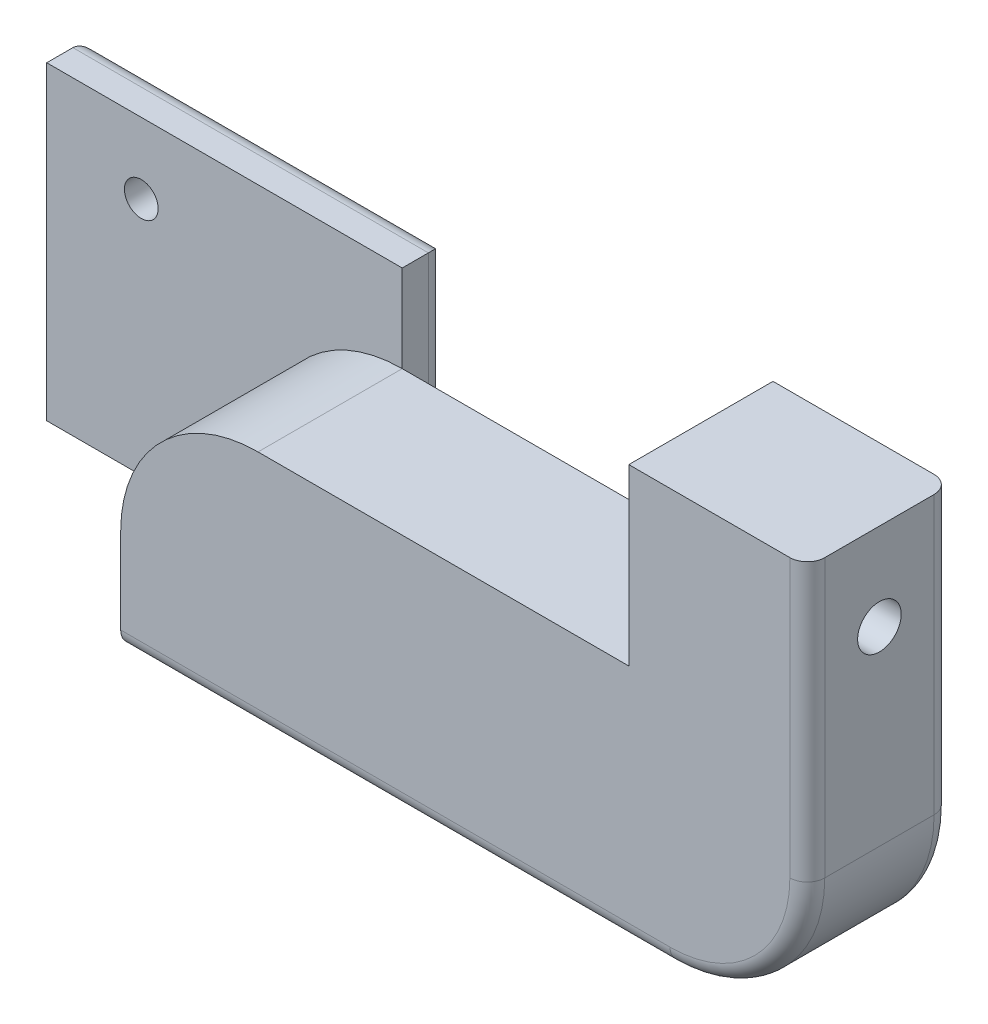
ISO-10303-21;
HEADER;
FILE_DESCRIPTION(('STEP AP214'),'2;1');
FILE_NAME('part.step','',(''),(''),'','','');
FILE_SCHEMA(('AUTOMOTIVE_DESIGN { 1 0 10303 214 1 1 1 1 }'));
ENDSEC;
DATA;
#1=APPLICATION_CONTEXT('core data for automotive mechanical design processes');
#2=APPLICATION_PROTOCOL_DEFINITION('international standard','automotive_design',2000,#1);
#3=PRODUCT_CONTEXT('',#1,'mechanical');
#4=PRODUCT('Part','Part','',(#3));
#5=PRODUCT_RELATED_PRODUCT_CATEGORY('part','',(#4));
#6=PRODUCT_DEFINITION_FORMATION('','',#4);
#7=PRODUCT_DEFINITION_CONTEXT('part definition',#1,'design');
#8=PRODUCT_DEFINITION('design','',#6,#7);
#9=PRODUCT_DEFINITION_SHAPE('','',#8);
#10=(LENGTH_UNIT() NAMED_UNIT(*) SI_UNIT(.MILLI.,.METRE.));
#11=(NAMED_UNIT(*) PLANE_ANGLE_UNIT() SI_UNIT($,.RADIAN.));
#12=(NAMED_UNIT(*) SI_UNIT($,.STERADIAN.) SOLID_ANGLE_UNIT());
#13=UNCERTAINTY_MEASURE_WITH_UNIT(LENGTH_MEASURE(1.E-05),#10,'distance_accuracy_value','');
#14=(GEOMETRIC_REPRESENTATION_CONTEXT(3) GLOBAL_UNCERTAINTY_ASSIGNED_CONTEXT((#13)) GLOBAL_UNIT_ASSIGNED_CONTEXT((#10,
#11,#12)) REPRESENTATION_CONTEXT('',''));
#15=CARTESIAN_POINT('',(0.,0.,0.));
#16=DIRECTION('',(0.,0.,1.));
#17=DIRECTION('',(1.,0.,0.));
#18=AXIS2_PLACEMENT_3D('',#15,#16,#17);
#19=CARTESIAN_POINT('',(24.,30.2,-10.5));
#20=DIRECTION('',(-1.,0.,0.));
#21=DIRECTION('',(0.,0.,-1.));
#22=AXIS2_PLACEMENT_3D('',#19,#20,#21);
#23=CYLINDRICAL_SURFACE('',#22,3.175);
#24=CARTESIAN_POINT('',(50.,30.2,-10.5));
#25=DIRECTION('',(1.,0.,0.));
#26=DIRECTION('',(0.,0.,-1.));
#27=AXIS2_PLACEMENT_3D('',#24,#25,#26);
#28=CIRCLE('',#27,3.175);
#29=CARTESIAN_POINT('',(50.,30.2,-13.675));
#30=VERTEX_POINT('',#29);
#31=EDGE_CURVE('E246',#30,#30,#28,.T.);
#32=ORIENTED_EDGE('',*,*,#31,.T.);
#33=EDGE_LOOP('',(#32));
#34=FACE_BOUND('',#33,.T.);
#35=CARTESIAN_POINT('',(40.475,30.2,-10.5));
#36=DIRECTION('',(1.,0.,0.));
#37=DIRECTION('',(0.,-1.,0.));
#38=AXIS2_PLACEMENT_3D('',#35,#36,#37);
#39=CIRCLE('',#38,3.175);
#40=CARTESIAN_POINT('',(40.475,27.025,-10.5));
#41=VERTEX_POINT('',#40);
#42=EDGE_CURVE('E41',#41,#41,#39,.F.);
#43=ORIENTED_EDGE('',*,*,#42,.T.);
#44=EDGE_LOOP('',(#43));
#45=FACE_BOUND('',#44,.T.);
#46=ADVANCED_FACE('F37',(#34,#45),#23,.F.);
#47=CARTESIAN_POINT('',(-30.,-2.5,-21.));
#48=DIRECTION('',(0.,0.,1.));
#49=DIRECTION('',(-1.,0.,0.));
#50=AXIS2_PLACEMENT_3D('',#47,#48,#49);
#51=PLANE('',#50);
#52=DIRECTION('',(0.,1.,0.));
#53=VECTOR('',#52,1.);
#54=CARTESIAN_POINT('',(-30.,-14.96,-21.));
#55=LINE('',#54,#53);
#56=CARTESIAN_POINT('',(-30.,-14.96,-21.));
#57=VERTEX_POINT('',#56);
#58=CARTESIAN_POINT('',(-30.,17.5,-21.));
#59=VERTEX_POINT('',#58);
#60=EDGE_CURVE('E257',#57,#59,#55,.T.);
#61=ORIENTED_EDGE('',*,*,#60,.T.);
#62=DIRECTION('',(-1.,0.,0.));
#63=VECTOR('',#62,1.);
#64=CARTESIAN_POINT('',(-30.,17.5,-21.));
#65=LINE('',#64,#63);
#66=CARTESIAN_POINT('',(24.,17.5,-21.));
#67=VERTEX_POINT('',#66);
#68=EDGE_CURVE('E284',#67,#59,#65,.T.);
#69=ORIENTED_EDGE('',*,*,#68,.F.);
#70=DIRECTION('',(0.,-1.,0.));
#71=VECTOR('',#70,1.);
#72=CARTESIAN_POINT('',(24.,17.5,-21.));
#73=LINE('',#72,#71);
#74=CARTESIAN_POINT('',(24.,42.9,-21.));
#75=VERTEX_POINT('',#74);
#76=EDGE_CURVE('E280',#75,#67,#73,.T.);
#77=ORIENTED_EDGE('',*,*,#76,.F.);
#78=DIRECTION('',(-1.,0.,0.));
#79=VECTOR('',#78,1.);
#80=CARTESIAN_POINT('',(24.,42.9,-21.));
#81=LINE('',#80,#79);
#82=CARTESIAN_POINT('',(47.46,42.9,-21.));
#83=VERTEX_POINT('',#82);
#84=EDGE_CURVE('E277',#83,#75,#81,.T.);
#85=ORIENTED_EDGE('',*,*,#84,.F.);
#86=DIRECTION('',(0.,1.,0.));
#87=VECTOR('',#86,1.);
#88=CARTESIAN_POINT('',(47.46,-2.50000000000003,-21.));
#89=LINE('',#88,#87);
#90=CARTESIAN_POINT('',(47.46,2.5,-21.));
#91=VERTEX_POINT('',#90);
#92=EDGE_CURVE('E332',#91,#83,#89,.T.);
#93=ORIENTED_EDGE('',*,*,#92,.F.);
#94=CARTESIAN_POINT('',(30.,2.5,-21.));
#95=DIRECTION('',(0.,0.,-1.));
#96=DIRECTION('',(-1.,0.,0.));
#97=AXIS2_PLACEMENT_3D('',#94,#95,#96);
#98=CIRCLE('',#97,17.46);
#99=CARTESIAN_POINT('',(30.,-14.96,-21.));
#100=VERTEX_POINT('',#99);
#101=EDGE_CURVE('E335',#100,#91,#98,.F.);
#102=ORIENTED_EDGE('',*,*,#101,.F.);
#103=DIRECTION('',(1.,0.,0.));
#104=VECTOR('',#103,1.);
#105=CARTESIAN_POINT('',(-30.,-14.96,-21.));
#106=LINE('',#105,#104);
#107=EDGE_CURVE('E338',#57,#100,#106,.T.);
#108=ORIENTED_EDGE('',*,*,#107,.F.);
#109=EDGE_LOOP('',(#61,#69,#77,#85,#93,#102,#108));
#110=FACE_BOUND('',#109,.T.);
#111=ADVANCED_FACE('F438',(#110),#51,.F.);
#112=CARTESIAN_POINT('',(24.,42.9,-21.));
#113=DIRECTION('',(0.,-1.,0.));
#114=DIRECTION('',(0.,0.,1.));
#115=AXIS2_PLACEMENT_3D('',#112,#113,#114);
#116=PLANE('',#115);
#117=ORIENTED_EDGE('',*,*,#84,.T.);
#118=DIRECTION('',(0.,0.,1.));
#119=VECTOR('',#118,1.);
#120=CARTESIAN_POINT('',(24.,42.9,-21.));
#121=LINE('',#120,#119);
#122=CARTESIAN_POINT('',(24.,42.9,0.));
#123=VERTEX_POINT('',#122);
#124=EDGE_CURVE('E326',#75,#123,#121,.T.);
#125=ORIENTED_EDGE('',*,*,#124,.T.);
#126=DIRECTION('',(-1.,0.,0.));
#127=VECTOR('',#126,1.);
#128=CARTESIAN_POINT('',(24.,42.9,0.));
#129=LINE('',#128,#127);
#130=CARTESIAN_POINT('',(47.46,42.9,0.));
#131=VERTEX_POINT('',#130);
#132=EDGE_CURVE('E294',#131,#123,#129,.T.);
#133=ORIENTED_EDGE('',*,*,#132,.F.);
#134=CARTESIAN_POINT('',(47.46,42.9,-2.54));
#135=DIRECTION('',(0.,1.,0.));
#136=DIRECTION('',(0.,0.,1.));
#137=AXIS2_PLACEMENT_3D('',#134,#135,#136);
#138=CIRCLE('',#137,2.54);
#139=CARTESIAN_POINT('',(50.,42.9,-2.54000000000001));
#140=VERTEX_POINT('',#139);
#141=EDGE_CURVE('E367',#140,#131,#138,.F.);
#142=ORIENTED_EDGE('',*,*,#141,.F.);
#143=DIRECTION('',(0.,0.,1.));
#144=VECTOR('',#143,1.);
#145=CARTESIAN_POINT('',(50.,42.9,-21.));
#146=LINE('',#145,#144);
#147=CARTESIAN_POINT('',(50.,42.9,-18.46));
#148=VERTEX_POINT('',#147);
#149=EDGE_CURVE('E329',#148,#140,#146,.T.);
#150=ORIENTED_EDGE('',*,*,#149,.F.);
#151=CARTESIAN_POINT('',(47.46,42.9,-18.46));
#152=DIRECTION('',(0.,1.,0.));
#153=DIRECTION('',(0.,0.,1.));
#154=AXIS2_PLACEMENT_3D('',#151,#152,#153);
#155=CIRCLE('',#154,2.54);
#156=EDGE_CURVE('E370',#83,#148,#155,.F.);
#157=ORIENTED_EDGE('',*,*,#156,.F.);
#158=EDGE_LOOP('',(#117,#125,#133,#142,#150,#157));
#159=FACE_BOUND('',#158,.T.);
#160=ADVANCED_FACE('F474',(#159),#116,.F.);
#161=CARTESIAN_POINT('',(24.,17.5,-21.));
#162=DIRECTION('',(1.,0.,0.));
#163=DIRECTION('',(0.,0.,1.));
#164=AXIS2_PLACEMENT_3D('',#161,#162,#163);
#165=PLANE('',#164);
#166=DIRECTION('',(0.,0.,1.));
#167=VECTOR('',#166,1.);
#168=CARTESIAN_POINT('',(24.,35.88325,-13.7812259173719));
#169=LINE('',#168,#167);
#170=CARTESIAN_POINT('',(24.,35.88325,-13.7812259173719));
#171=VERTEX_POINT('',#170);
#172=CARTESIAN_POINT('',(24.,35.88325,-7.21877408262805));
#173=VERTEX_POINT('',#172);
#174=EDGE_CURVE('E205',#171,#173,#169,.T.);
#175=ORIENTED_EDGE('',*,*,#174,.T.);
#176=DIRECTION('',(0.,-0.866025403784439,0.5));
#177=VECTOR('',#176,1.);
#178=CARTESIAN_POINT('',(24.,35.88325,-7.21877408262805));
#179=LINE('',#178,#177);
#180=CARTESIAN_POINT('',(24.,30.2,-3.93754816525612));
#181=VERTEX_POINT('',#180);
#182=EDGE_CURVE('E214',#173,#181,#179,.T.);
#183=ORIENTED_EDGE('',*,*,#182,.T.);
#184=DIRECTION('',(0.,-0.866025403784439,-0.5));
#185=VECTOR('',#184,1.);
#186=CARTESIAN_POINT('',(24.,30.2,-3.93754816525612));
#187=LINE('',#186,#185);
#188=CARTESIAN_POINT('',(24.,24.51675,-7.21877408262806));
#189=VERTEX_POINT('',#188);
#190=EDGE_CURVE('E219',#181,#189,#187,.T.);
#191=ORIENTED_EDGE('',*,*,#190,.T.);
#192=DIRECTION('',(0.,0.,-1.));
#193=VECTOR('',#192,1.);
#194=CARTESIAN_POINT('',(24.,24.51675,-7.21877408262806));
#195=LINE('',#194,#193);
#196=CARTESIAN_POINT('',(24.,24.51675,-13.7812259173719));
#197=VERTEX_POINT('',#196);
#198=EDGE_CURVE('E230',#189,#197,#195,.T.);
#199=ORIENTED_EDGE('',*,*,#198,.T.);
#200=DIRECTION('',(0.,0.866025403784438,-0.5));
#201=VECTOR('',#200,1.);
#202=CARTESIAN_POINT('',(24.,24.51675,-13.7812259173719));
#203=LINE('',#202,#201);
#204=CARTESIAN_POINT('',(24.,30.2,-17.0624518347439));
#205=VERTEX_POINT('',#204);
#206=EDGE_CURVE('E233',#197,#205,#203,.T.);
#207=ORIENTED_EDGE('',*,*,#206,.T.);
#208=DIRECTION('',(0.,0.866025403784439,0.5));
#209=VECTOR('',#208,1.);
#210=CARTESIAN_POINT('',(24.,30.2,-17.0624518347439));
#211=LINE('',#210,#209);
#212=EDGE_CURVE('E224',#205,#171,#211,.T.);
#213=ORIENTED_EDGE('',*,*,#212,.T.);
#214=EDGE_LOOP('',(#175,#183,#191,#199,#207,#213));
#215=FACE_BOUND('',#214,.T.);
#216=DIRECTION('',(0.,-1.,0.));
#217=VECTOR('',#216,1.);
#218=CARTESIAN_POINT('',(24.,17.5,0.));
#219=LINE('',#218,#217);
#220=CARTESIAN_POINT('',(24.,17.5,0.));
#221=VERTEX_POINT('',#220);
#222=EDGE_CURVE('E297',#123,#221,#219,.T.);
#223=ORIENTED_EDGE('',*,*,#222,.F.);
#224=ORIENTED_EDGE('',*,*,#124,.F.);
#225=ORIENTED_EDGE('',*,*,#76,.T.);
#226=DIRECTION('',(0.,0.,1.));
#227=VECTOR('',#226,1.);
#228=CARTESIAN_POINT('',(24.,17.5,-21.));
#229=LINE('',#228,#227);
#230=EDGE_CURVE('E323',#67,#221,#229,.T.);
#231=ORIENTED_EDGE('',*,*,#230,.T.);
#232=EDGE_LOOP('',(#223,#224,#225,#231));
#233=FACE_BOUND('',#232,.T.);
#234=ADVANCED_FACE('F221',(#215,#233),#165,.F.);
#235=CARTESIAN_POINT('',(-30.,17.5,-21.));
#236=DIRECTION('',(0.,-1.,0.));
#237=DIRECTION('',(1.,0.,0.));
#238=AXIS2_PLACEMENT_3D('',#235,#236,#237);
#239=PLANE('',#238);
#240=DIRECTION('',(-1.,0.,0.));
#241=VECTOR('',#240,1.);
#242=CARTESIAN_POINT('',(-30.,17.5,0.));
#243=LINE('',#242,#241);
#244=CARTESIAN_POINT('',(-30.,17.5,0.));
#245=VERTEX_POINT('',#244);
#246=EDGE_CURVE('E301',#221,#245,#243,.T.);
#247=ORIENTED_EDGE('',*,*,#246,.F.);
#248=ORIENTED_EDGE('',*,*,#230,.F.);
#249=ORIENTED_EDGE('',*,*,#68,.T.);
#250=DIRECTION('',(0.,0.,1.));
#251=VECTOR('',#250,1.);
#252=CARTESIAN_POINT('',(-30.,17.5,-21.));
#253=LINE('',#252,#251);
#254=EDGE_CURVE('E320',#59,#245,#253,.T.);
#255=ORIENTED_EDGE('',*,*,#254,.T.);
#256=EDGE_LOOP('',(#247,#248,#249,#255));
#257=FACE_BOUND('',#256,.T.);
#258=ADVANCED_FACE('F522',(#257),#239,.F.);
#259=CARTESIAN_POINT('',(-30.,-2.5,-21.));
#260=DIRECTION('',(0.,0.,1.));
#261=DIRECTION('',(-1.,0.,0.));
#262=AXIS2_PLACEMENT_3D('',#259,#260,#261);
#263=CYLINDRICAL_SURFACE('',#262,20.);
#264=CARTESIAN_POINT('',(-30.,-2.5,0.));
#265=DIRECTION('',(0.,0.,1.));
#266=DIRECTION('',(-1.,0.,0.));
#267=AXIS2_PLACEMENT_3D('',#264,#265,#266);
#268=CIRCLE('',#267,20.);
#269=CARTESIAN_POINT('',(-50.,-2.5,0.));
#270=VERTEX_POINT('',#269);
#271=EDGE_CURVE('E304',#245,#270,#268,.T.);
#272=ORIENTED_EDGE('',*,*,#271,.F.);
#273=ORIENTED_EDGE('',*,*,#254,.F.);
#274=CARTESIAN_POINT('',(-30.,-2.5,-21.));
#275=DIRECTION('',(0.,0.,1.));
#276=DIRECTION('',(-1.,0.,0.));
#277=AXIS2_PLACEMENT_3D('',#274,#275,#276);
#278=CIRCLE('',#277,20.);
#279=CARTESIAN_POINT('',(-50.,-2.5,-21.));
#280=VERTEX_POINT('',#279);
#281=EDGE_CURVE('E287',#59,#280,#278,.T.);
#282=ORIENTED_EDGE('',*,*,#281,.T.);
#283=DIRECTION('',(0.,0.,1.));
#284=VECTOR('',#283,1.);
#285=CARTESIAN_POINT('',(-50.,-2.5,-21.));
#286=LINE('',#285,#284);
#287=EDGE_CURVE('E317',#280,#270,#286,.T.);
#288=ORIENTED_EDGE('',*,*,#287,.T.);
#289=EDGE_LOOP('',(#272,#273,#282,#288));
#290=FACE_BOUND('',#289,.T.);
#291=ADVANCED_FACE('F518',(#290),#263,.T.);
#292=CARTESIAN_POINT('',(-50.,-17.5,-21.));
#293=DIRECTION('',(1.,0.,0.));
#294=DIRECTION('',(0.,1.,0.));
#295=AXIS2_PLACEMENT_3D('',#292,#293,#294);
#296=PLANE('',#295);
#297=DIRECTION('',(0.,0.,1.));
#298=VECTOR('',#297,1.);
#299=CARTESIAN_POINT('',(-50.,-17.5,-21.));
#300=LINE('',#299,#298);
#301=CARTESIAN_POINT('',(-50.,-17.5,-18.46));
#302=VERTEX_POINT('',#301);
#303=CARTESIAN_POINT('',(-50.,-17.5,-2.54000000000001));
#304=VERTEX_POINT('',#303);
#305=EDGE_CURVE('E314',#302,#304,#300,.T.);
#306=ORIENTED_EDGE('',*,*,#305,.T.);
#307=CARTESIAN_POINT('',(-50.,-14.96,-2.54));
#308=DIRECTION('',(-1.,0.,0.));
#309=DIRECTION('',(0.,1.,0.));
#310=AXIS2_PLACEMENT_3D('',#307,#308,#309);
#311=CIRCLE('',#310,2.54);
#312=CARTESIAN_POINT('',(-50.,-14.96,0.));
#313=VERTEX_POINT('',#312);
#314=EDGE_CURVE('E347',#313,#304,#311,.F.);
#315=ORIENTED_EDGE('',*,*,#314,.F.);
#316=DIRECTION('',(0.,-1.,0.));
#317=VECTOR('',#316,1.);
#318=CARTESIAN_POINT('',(-50.,-17.5,0.));
#319=LINE('',#318,#317);
#320=EDGE_CURVE('E281',#270,#313,#319,.T.);
#321=ORIENTED_EDGE('',*,*,#320,.F.);
#322=ORIENTED_EDGE('',*,*,#287,.F.);
#323=DIRECTION('',(0.,-1.,0.));
#324=VECTOR('',#323,1.);
#325=CARTESIAN_POINT('',(-50.,-17.5,-21.));
#326=LINE('',#325,#324);
#327=CARTESIAN_POINT('',(-50.,-14.96,-21.));
#328=VERTEX_POINT('',#327);
#329=EDGE_CURVE('E290',#280,#328,#326,.T.);
#330=ORIENTED_EDGE('',*,*,#329,.T.);
#331=CARTESIAN_POINT('',(-50.,-14.96,-18.46));
#332=DIRECTION('',(-1.,0.,0.));
#333=DIRECTION('',(0.,1.,0.));
#334=AXIS2_PLACEMENT_3D('',#331,#332,#333);
#335=CIRCLE('',#334,2.54);
#336=EDGE_CURVE('E350',#302,#328,#335,.F.);
#337=ORIENTED_EDGE('',*,*,#336,.F.);
#338=EDGE_LOOP('',(#306,#315,#321,#322,#330,#337));
#339=FACE_BOUND('',#338,.T.);
#340=ADVANCED_FACE('F514',(#339),#296,.F.);
#341=CARTESIAN_POINT('',(-50.,-17.5,-21.));
#342=DIRECTION('',(0.,1.,0.));
#343=DIRECTION('',(-1.,0.,0.));
#344=AXIS2_PLACEMENT_3D('',#341,#342,#343);
#345=PLANE('',#344);
#346=DIRECTION('',(0.,0.,1.));
#347=VECTOR('',#346,1.);
#348=CARTESIAN_POINT('',(30.,-17.5,-21.));
#349=LINE('',#348,#347);
#350=CARTESIAN_POINT('',(30.,-17.5,-18.46));
#351=VERTEX_POINT('',#350);
#352=CARTESIAN_POINT('',(30.,-17.5,-2.54000000000001));
#353=VERTEX_POINT('',#352);
#354=EDGE_CURVE('E311',#351,#353,#349,.T.);
#355=ORIENTED_EDGE('',*,*,#354,.T.);
#356=DIRECTION('',(1.,0.,0.));
#357=VECTOR('',#356,1.);
#358=CARTESIAN_POINT('',(30.,-17.5,-2.54));
#359=LINE('',#358,#357);
#360=EDGE_CURVE('E342',#304,#353,#359,.T.);
#361=ORIENTED_EDGE('',*,*,#360,.F.);
#362=ORIENTED_EDGE('',*,*,#305,.F.);
#363=DIRECTION('',(1.,0.,0.));
#364=VECTOR('',#363,1.);
#365=CARTESIAN_POINT('',(-50.,-17.5,-18.46));
#366=LINE('',#365,#364);
#367=EDGE_CURVE('E345',#351,#302,#366,.F.);
#368=ORIENTED_EDGE('',*,*,#367,.F.);
#369=EDGE_LOOP('',(#355,#361,#362,#368));
#370=FACE_BOUND('',#369,.T.);
#371=ADVANCED_FACE('F510',(#370),#345,.F.);
#372=CARTESIAN_POINT('',(30.,2.5,-21.));
#373=DIRECTION('',(0.,0.,1.));
#374=DIRECTION('',(-1.,0.,0.));
#375=AXIS2_PLACEMENT_3D('',#372,#373,#374);
#376=CYLINDRICAL_SURFACE('',#375,20.);
#377=DIRECTION('',(0.,0.,1.));
#378=VECTOR('',#377,1.);
#379=CARTESIAN_POINT('',(50.,2.5,-21.));
#380=LINE('',#379,#378);
#381=CARTESIAN_POINT('',(50.,2.5,-18.46));
#382=VERTEX_POINT('',#381);
#383=CARTESIAN_POINT('',(50.,2.5,-2.54000000000001));
#384=VERTEX_POINT('',#383);
#385=EDGE_CURVE('E293',#382,#384,#380,.T.);
#386=ORIENTED_EDGE('',*,*,#385,.T.);
#387=CARTESIAN_POINT('',(30.,2.5,-2.54));
#388=DIRECTION('',(0.,0.,-1.));
#389=DIRECTION('',(-1.,0.,0.));
#390=AXIS2_PLACEMENT_3D('',#387,#388,#389);
#391=CIRCLE('',#390,20.);
#392=EDGE_CURVE('E353',#353,#384,#391,.F.);
#393=ORIENTED_EDGE('',*,*,#392,.F.);
#394=ORIENTED_EDGE('',*,*,#354,.F.);
#395=CARTESIAN_POINT('',(30.,2.5,-18.46));
#396=DIRECTION('',(0.,0.,-1.));
#397=DIRECTION('',(-1.,0.,0.));
#398=AXIS2_PLACEMENT_3D('',#395,#396,#397);
#399=CIRCLE('',#398,20.);
#400=EDGE_CURVE('E356',#382,#351,#399,.T.);
#401=ORIENTED_EDGE('',*,*,#400,.F.);
#402=EDGE_LOOP('',(#386,#393,#394,#401));
#403=FACE_BOUND('',#402,.T.);
#404=ADVANCED_FACE('F506',(#403),#376,.T.);
#405=CARTESIAN_POINT('',(50.,2.5,-21.));
#406=DIRECTION('',(-1.,0.,0.));
#407=DIRECTION('',(0.,-1.,0.));
#408=AXIS2_PLACEMENT_3D('',#405,#406,#407);
#409=PLANE('',#408);
#410=ORIENTED_EDGE('',*,*,#31,.F.);
#411=EDGE_LOOP('',(#410));
#412=FACE_BOUND('',#411,.T.);
#413=ORIENTED_EDGE('',*,*,#149,.T.);
#414=DIRECTION('',(0.,1.,0.));
#415=VECTOR('',#414,1.);
#416=CARTESIAN_POINT('',(50.,42.9,-2.54));
#417=LINE('',#416,#415);
#418=EDGE_CURVE('E373',#384,#140,#417,.T.);
#419=ORIENTED_EDGE('',*,*,#418,.F.);
#420=ORIENTED_EDGE('',*,*,#385,.F.);
#421=DIRECTION('',(0.,1.,0.));
#422=VECTOR('',#421,1.);
#423=CARTESIAN_POINT('',(50.,2.5,-18.46));
#424=LINE('',#423,#422);
#425=EDGE_CURVE('E375',#148,#382,#424,.F.);
#426=ORIENTED_EDGE('',*,*,#425,.F.);
#427=EDGE_LOOP('',(#413,#419,#420,#426));
#428=FACE_BOUND('',#427,.T.);
#429=ADVANCED_FACE('F502',(#412,#428),#409,.F.);
#430=CARTESIAN_POINT('',(-30.,-2.5,0.));
#431=DIRECTION('',(0.,0.,1.));
#432=DIRECTION('',(-1.,0.,0.));
#433=AXIS2_PLACEMENT_3D('',#430,#431,#432);
#434=PLANE('',#433);
#435=CARTESIAN_POINT('',(30.,2.5,0.));
#436=DIRECTION('',(0.,0.,-1.));
#437=DIRECTION('',(-1.,0.,0.));
#438=AXIS2_PLACEMENT_3D('',#435,#436,#437);
#439=CIRCLE('',#438,17.46);
#440=CARTESIAN_POINT('',(47.46,2.5,0.));
#441=VERTEX_POINT('',#440);
#442=CARTESIAN_POINT('',(30.,-14.96,0.));
#443=VERTEX_POINT('',#442);
#444=EDGE_CURVE('E362',#441,#443,#439,.T.);
#445=ORIENTED_EDGE('',*,*,#444,.F.);
#446=DIRECTION('',(0.,1.,0.));
#447=VECTOR('',#446,1.);
#448=CARTESIAN_POINT('',(47.46,2.5,0.));
#449=LINE('',#448,#447);
#450=EDGE_CURVE('E359',#131,#441,#449,.F.);
#451=ORIENTED_EDGE('',*,*,#450,.F.);
#452=ORIENTED_EDGE('',*,*,#132,.T.);
#453=ORIENTED_EDGE('',*,*,#222,.T.);
#454=ORIENTED_EDGE('',*,*,#246,.T.);
#455=ORIENTED_EDGE('',*,*,#271,.T.);
#456=ORIENTED_EDGE('',*,*,#320,.T.);
#457=DIRECTION('',(1.,0.,0.));
#458=VECTOR('',#457,1.);
#459=CARTESIAN_POINT('',(-50.,-14.96,0.));
#460=LINE('',#459,#458);
#461=EDGE_CURVE('E365',#443,#313,#460,.F.);
#462=ORIENTED_EDGE('',*,*,#461,.F.);
#463=EDGE_LOOP('',(#445,#451,#452,#453,#454,#455,#456,#462));
#464=FACE_BOUND('',#463,.T.);
#465=ADVANCED_FACE('F498',(#464),#434,.T.);
#466=CARTESIAN_POINT('',(47.46,-2.50000000000003,-18.46));
#467=DIRECTION('',(0.,1.,0.));
#468=DIRECTION('',(-1.,0.,0.));
#469=AXIS2_PLACEMENT_3D('',#466,#467,#468);
#470=CYLINDRICAL_SURFACE('',#469,2.54);
#471=ORIENTED_EDGE('',*,*,#156,.T.);
#472=ORIENTED_EDGE('',*,*,#425,.T.);
#473=CARTESIAN_POINT('',(47.46,2.5,-18.46));
#474=DIRECTION('',(0.,1.,0.));
#475=DIRECTION('',(0.,0.,1.));
#476=AXIS2_PLACEMENT_3D('',#473,#474,#475);
#477=CIRCLE('',#476,2.54);
#478=EDGE_CURVE('E298',#382,#91,#477,.T.);
#479=ORIENTED_EDGE('',*,*,#478,.T.);
#480=ORIENTED_EDGE('',*,*,#92,.T.);
#481=EDGE_LOOP('',(#471,#472,#479,#480));
#482=FACE_BOUND('',#481,.T.);
#483=ADVANCED_FACE('F501',(#482),#470,.T.);
#484=CARTESIAN_POINT('',(30.,2.5,-18.46));
#485=DIRECTION('',(0.,0.,1.));
#486=DIRECTION('',(-1.,0.,0.));
#487=AXIS2_PLACEMENT_3D('',#484,#485,#486);
#488=TOROIDAL_SURFACE('',#487,17.46,2.54);
#489=ORIENTED_EDGE('',*,*,#478,.F.);
#490=ORIENTED_EDGE('',*,*,#400,.T.);
#491=CARTESIAN_POINT('',(30.,-14.96,-18.46));
#492=DIRECTION('',(1.,0.,0.));
#493=DIRECTION('',(0.,0.,-1.));
#494=AXIS2_PLACEMENT_3D('',#491,#492,#493);
#495=CIRCLE('',#494,2.54);
#496=EDGE_CURVE('E379',#351,#100,#495,.T.);
#497=ORIENTED_EDGE('',*,*,#496,.T.);
#498=ORIENTED_EDGE('',*,*,#101,.T.);
#499=EDGE_LOOP('',(#489,#490,#497,#498));
#500=FACE_BOUND('',#499,.T.);
#501=ADVANCED_FACE('F535',(#500),#488,.T.);
#502=CARTESIAN_POINT('',(-30.,-14.96,-18.46));
#503=DIRECTION('',(1.,0.,0.));
#504=DIRECTION('',(0.,1.,0.));
#505=AXIS2_PLACEMENT_3D('',#502,#503,#504);
#506=CYLINDRICAL_SURFACE('',#505,2.54);
#507=ORIENTED_EDGE('',*,*,#336,.T.);
#508=EDGE_CURVE('E339',#328,#57,#106,.T.);
#509=ORIENTED_EDGE('',*,*,#508,.T.);
#510=ORIENTED_EDGE('',*,*,#107,.T.);
#511=ORIENTED_EDGE('',*,*,#496,.F.);
#512=ORIENTED_EDGE('',*,*,#367,.T.);
#513=EDGE_LOOP('',(#507,#509,#510,#511,#512));
#514=FACE_BOUND('',#513,.T.);
#515=ADVANCED_FACE('F444',(#514),#506,.T.);
#516=CARTESIAN_POINT('',(47.46,2.5,-2.54));
#517=DIRECTION('',(0.,-1.,0.));
#518=DIRECTION('',(1.,0.,0.));
#519=AXIS2_PLACEMENT_3D('',#516,#517,#518);
#520=CYLINDRICAL_SURFACE('',#519,2.54);
#521=ORIENTED_EDGE('',*,*,#141,.T.);
#522=ORIENTED_EDGE('',*,*,#450,.T.);
#523=CARTESIAN_POINT('',(47.46,2.5,-2.54));
#524=DIRECTION('',(0.,1.,0.));
#525=DIRECTION('',(0.,0.,1.));
#526=AXIS2_PLACEMENT_3D('',#523,#524,#525);
#527=CIRCLE('',#526,2.54);
#528=EDGE_CURVE('E381',#441,#384,#527,.T.);
#529=ORIENTED_EDGE('',*,*,#528,.T.);
#530=ORIENTED_EDGE('',*,*,#418,.T.);
#531=EDGE_LOOP('',(#521,#522,#529,#530));
#532=FACE_BOUND('',#531,.T.);
#533=ADVANCED_FACE('F534',(#532),#520,.T.);
#534=CARTESIAN_POINT('',(30.,2.5,-2.54));
#535=DIRECTION('',(0.,0.,1.));
#536=DIRECTION('',(-1.,0.,0.));
#537=AXIS2_PLACEMENT_3D('',#534,#535,#536);
#538=TOROIDAL_SURFACE('',#537,17.46,2.54);
#539=ORIENTED_EDGE('',*,*,#528,.F.);
#540=ORIENTED_EDGE('',*,*,#444,.T.);
#541=CARTESIAN_POINT('',(30.,-14.96,-2.54));
#542=DIRECTION('',(1.,0.,0.));
#543=DIRECTION('',(0.,0.,-1.));
#544=AXIS2_PLACEMENT_3D('',#541,#542,#543);
#545=CIRCLE('',#544,2.54);
#546=EDGE_CURVE('E276',#443,#353,#545,.T.);
#547=ORIENTED_EDGE('',*,*,#546,.T.);
#548=ORIENTED_EDGE('',*,*,#392,.T.);
#549=EDGE_LOOP('',(#539,#540,#547,#548));
#550=FACE_BOUND('',#549,.T.);
#551=ADVANCED_FACE('F544',(#550),#538,.T.);
#552=CARTESIAN_POINT('',(-50.,-14.96,-2.54));
#553=DIRECTION('',(-1.,0.,0.));
#554=DIRECTION('',(0.,-1.,0.));
#555=AXIS2_PLACEMENT_3D('',#552,#553,#554);
#556=CYLINDRICAL_SURFACE('',#555,2.54);
#557=ORIENTED_EDGE('',*,*,#314,.T.);
#558=ORIENTED_EDGE('',*,*,#360,.T.);
#559=ORIENTED_EDGE('',*,*,#546,.F.);
#560=ORIENTED_EDGE('',*,*,#461,.T.);
#561=EDGE_LOOP('',(#557,#558,#559,#560));
#562=FACE_BOUND('',#561,.T.);
#563=ADVANCED_FACE('F488',(#562),#556,.T.);
#564=CARTESIAN_POINT('',(0.,0.,-21.));
#565=DIRECTION('',(0.,0.,-1.));
#566=DIRECTION('',(1.,0.,0.));
#567=AXIS2_PLACEMENT_3D('',#564,#565,#566);
#568=PLANE('',#567);
#569=CARTESIAN_POINT('',(-68.,19.9,-21.));
#570=DIRECTION('',(0.,0.,1.));
#571=DIRECTION('',(1.,0.,0.));
#572=AXIS2_PLACEMENT_3D('',#569,#570,#571);
#573=CIRCLE('',#572,2.45745);
#574=CARTESIAN_POINT('',(-65.54255,19.9,-21.));
#575=VERTEX_POINT('',#574);
#576=EDGE_CURVE('E253',#575,#575,#573,.T.);
#577=ORIENTED_EDGE('',*,*,#576,.F.);
#578=EDGE_LOOP('',(#577));
#579=FACE_BOUND('',#578,.T.);
#580=CARTESIAN_POINT('',(-30.,30.2,-21.));
#581=VERTEX_POINT('',#580);
#582=EDGE_CURVE('E256',#59,#581,#55,.T.);
#583=ORIENTED_EDGE('',*,*,#582,.T.);
#584=DIRECTION('',(-1.,0.,0.));
#585=VECTOR('',#584,1.);
#586=CARTESIAN_POINT('',(-30.,30.2,-21.));
#587=LINE('',#586,#585);
#588=CARTESIAN_POINT('',(-81.7709992502387,30.2,-21.));
#589=VERTEX_POINT('',#588);
#590=EDGE_CURVE('E260',#581,#589,#587,.T.);
#591=ORIENTED_EDGE('',*,*,#590,.T.);
#592=DIRECTION('',(0.,-1.,0.));
#593=VECTOR('',#592,1.);
#594=CARTESIAN_POINT('',(-81.7709992502387,-14.96,-21.));
#595=LINE('',#594,#593);
#596=CARTESIAN_POINT('',(-81.7709992502387,-14.96,-21.));
#597=VERTEX_POINT('',#596);
#598=EDGE_CURVE('E263',#589,#597,#595,.T.);
#599=ORIENTED_EDGE('',*,*,#598,.T.);
#600=DIRECTION('',(1.,0.,0.));
#601=VECTOR('',#600,1.);
#602=CARTESIAN_POINT('',(-30.,-14.96,-21.));
#603=LINE('',#602,#601);
#604=EDGE_CURVE('E266',#597,#328,#603,.T.);
#605=ORIENTED_EDGE('',*,*,#604,.T.);
#606=ORIENTED_EDGE('',*,*,#329,.F.);
#607=ORIENTED_EDGE('',*,*,#281,.F.);
#608=EDGE_LOOP('',(#583,#591,#599,#605,#606,#607));
#609=FACE_BOUND('',#608,.T.);
#610=ADVANCED_FACE('F433',(#579,#609),#568,.F.);
#611=CARTESIAN_POINT('',(-30.,-14.96,-27.35));
#612=DIRECTION('',(-1.,0.,0.));
#613=DIRECTION('',(0.,0.,-1.));
#614=AXIS2_PLACEMENT_3D('',#611,#612,#613);
#615=PLANE('',#614);
#616=DIRECTION('',(0.,0.,1.));
#617=VECTOR('',#616,1.);
#618=CARTESIAN_POINT('',(-30.,30.2,-27.35));
#619=LINE('',#618,#617);
#620=CARTESIAN_POINT('',(-30.,30.2,-24.81));
#621=VERTEX_POINT('',#620);
#622=EDGE_CURVE('E274',#621,#581,#619,.T.);
#623=ORIENTED_EDGE('',*,*,#622,.T.);
#624=ORIENTED_EDGE('',*,*,#582,.F.);
#625=ORIENTED_EDGE('',*,*,#60,.F.);
#626=DIRECTION('',(0.,0.,1.));
#627=VECTOR('',#626,1.);
#628=CARTESIAN_POINT('',(-30.,-14.96,-27.35));
#629=LINE('',#628,#627);
#630=CARTESIAN_POINT('',(-30.,-14.96,-24.81));
#631=VERTEX_POINT('',#630);
#632=EDGE_CURVE('E268',#631,#57,#629,.T.);
#633=ORIENTED_EDGE('',*,*,#632,.F.);
#634=DIRECTION('',(0.,1.,0.));
#635=VECTOR('',#634,1.);
#636=CARTESIAN_POINT('',(-30.,-14.96,-24.81));
#637=LINE('',#636,#635);
#638=EDGE_CURVE('E46',#621,#631,#637,.F.);
#639=ORIENTED_EDGE('',*,*,#638,.F.);
#640=EDGE_LOOP('',(#623,#624,#625,#633,#639));
#641=FACE_BOUND('',#640,.T.);
#642=ADVANCED_FACE('F425',(#641),#615,.F.);
#643=CARTESIAN_POINT('',(-30.,30.2,-27.35));
#644=DIRECTION('',(0.,-1.,0.));
#645=DIRECTION('',(1.,0.,0.));
#646=AXIS2_PLACEMENT_3D('',#643,#644,#645);
#647=PLANE('',#646);
#648=DIRECTION('',(0.,0.,1.));
#649=VECTOR('',#648,1.);
#650=CARTESIAN_POINT('',(-81.7709992502387,30.2,-27.35));
#651=LINE('',#650,#649);
#652=CARTESIAN_POINT('',(-81.7709992502387,30.2,-24.81));
#653=VERTEX_POINT('',#652);
#654=EDGE_CURVE('E272',#653,#589,#651,.T.);
#655=ORIENTED_EDGE('',*,*,#654,.T.);
#656=ORIENTED_EDGE('',*,*,#590,.F.);
#657=ORIENTED_EDGE('',*,*,#622,.F.);
#658=DIRECTION('',(-1.,0.,0.));
#659=VECTOR('',#658,1.);
#660=CARTESIAN_POINT('',(-30.,30.2,-24.81));
#661=LINE('',#660,#659);
#662=EDGE_CURVE('E12',#653,#621,#661,.F.);
#663=ORIENTED_EDGE('',*,*,#662,.F.);
#664=EDGE_LOOP('',(#655,#656,#657,#663));
#665=FACE_BOUND('',#664,.T.);
#666=ADVANCED_FACE('F428',(#665),#647,.F.);
#667=CARTESIAN_POINT('',(-81.7709992502387,-14.96,-27.35));
#668=DIRECTION('',(1.,0.,0.));
#669=DIRECTION('',(0.,0.,1.));
#670=AXIS2_PLACEMENT_3D('',#667,#668,#669);
#671=PLANE('',#670);
#672=DIRECTION('',(0.,0.,1.));
#673=VECTOR('',#672,1.);
#674=CARTESIAN_POINT('',(-81.7709992502387,-14.96,-27.35));
#675=LINE('',#674,#673);
#676=CARTESIAN_POINT('',(-81.7709992502387,-14.96,-24.81));
#677=VERTEX_POINT('',#676);
#678=EDGE_CURVE('E270',#677,#597,#675,.T.);
#679=ORIENTED_EDGE('',*,*,#678,.T.);
#680=ORIENTED_EDGE('',*,*,#598,.F.);
#681=ORIENTED_EDGE('',*,*,#654,.F.);
#682=DIRECTION('',(0.,-1.,0.));
#683=VECTOR('',#682,1.);
#684=CARTESIAN_POINT('',(-81.7709992502387,30.2,-24.81));
#685=LINE('',#684,#683);
#686=EDGE_CURVE('E395',#677,#653,#685,.F.);
#687=ORIENTED_EDGE('',*,*,#686,.F.);
#688=EDGE_LOOP('',(#679,#680,#681,#687));
#689=FACE_BOUND('',#688,.T.);
#690=ADVANCED_FACE('F453',(#689),#671,.F.);
#691=CARTESIAN_POINT('',(-30.,-14.96,-27.35));
#692=DIRECTION('',(0.,1.,0.));
#693=DIRECTION('',(-1.,0.,0.));
#694=AXIS2_PLACEMENT_3D('',#691,#692,#693);
#695=PLANE('',#694);
#696=ORIENTED_EDGE('',*,*,#632,.T.);
#697=ORIENTED_EDGE('',*,*,#508,.F.);
#698=ORIENTED_EDGE('',*,*,#604,.F.);
#699=ORIENTED_EDGE('',*,*,#678,.F.);
#700=DIRECTION('',(1.,0.,0.));
#701=VECTOR('',#700,1.);
#702=CARTESIAN_POINT('',(-81.7709992502387,-14.96,-24.81));
#703=LINE('',#702,#701);
#704=EDGE_CURVE('E398',#631,#677,#703,.F.);
#705=ORIENTED_EDGE('',*,*,#704,.F.);
#706=EDGE_LOOP('',(#696,#697,#698,#699,#705));
#707=FACE_BOUND('',#706,.T.);
#708=ADVANCED_FACE('F449',(#707),#695,.F.);
#709=CARTESIAN_POINT('',(0.,0.,-27.35));
#710=DIRECTION('',(0.,0.,-1.));
#711=DIRECTION('',(1.,0.,0.));
#712=AXIS2_PLACEMENT_3D('',#709,#710,#711);
#713=PLANE('',#712);
#714=DIRECTION('',(-1.,0.,0.));
#715=VECTOR('',#714,1.);
#716=CARTESIAN_POINT('',(-81.7709992502387,27.66,-27.35));
#717=LINE('',#716,#715);
#718=CARTESIAN_POINT('',(-32.54,27.66,-27.35));
#719=VERTEX_POINT('',#718);
#720=CARTESIAN_POINT('',(-79.2309992502387,27.66,-27.35));
#721=VERTEX_POINT('',#720);
#722=EDGE_CURVE('E378',#719,#721,#717,.T.);
#723=ORIENTED_EDGE('',*,*,#722,.F.);
#724=DIRECTION('',(0.,1.,0.));
#725=VECTOR('',#724,1.);
#726=CARTESIAN_POINT('',(-32.54,30.2,-27.35));
#727=LINE('',#726,#725);
#728=CARTESIAN_POINT('',(-32.54,-12.42,-27.35));
#729=VERTEX_POINT('',#728);
#730=EDGE_CURVE('E387',#729,#719,#727,.T.);
#731=ORIENTED_EDGE('',*,*,#730,.F.);
#732=DIRECTION('',(1.,0.,0.));
#733=VECTOR('',#732,1.);
#734=CARTESIAN_POINT('',(-30.,-12.42,-27.35));
#735=LINE('',#734,#733);
#736=CARTESIAN_POINT('',(-79.2309992502387,-12.42,-27.35));
#737=VERTEX_POINT('',#736);
#738=EDGE_CURVE('E389',#737,#729,#735,.T.);
#739=ORIENTED_EDGE('',*,*,#738,.F.);
#740=DIRECTION('',(0.,-1.,0.));
#741=VECTOR('',#740,1.);
#742=CARTESIAN_POINT('',(-79.2309992502387,-14.96,-27.35));
#743=LINE('',#742,#741);
#744=EDGE_CURVE('E392',#721,#737,#743,.T.);
#745=ORIENTED_EDGE('',*,*,#744,.F.);
#746=EDGE_LOOP('',(#723,#731,#739,#745));
#747=FACE_BOUND('',#746,.T.);
#748=CARTESIAN_POINT('',(-68.,19.9,-27.35));
#749=DIRECTION('',(0.,0.,1.));
#750=DIRECTION('',(1.,0.,0.));
#751=AXIS2_PLACEMENT_3D('',#748,#749,#750);
#752=CIRCLE('',#751,2.45745);
#753=CARTESIAN_POINT('',(-65.54255,19.9,-27.35));
#754=VERTEX_POINT('',#753);
#755=EDGE_CURVE('E250',#754,#754,#752,.T.);
#756=ORIENTED_EDGE('',*,*,#755,.T.);
#757=EDGE_LOOP('',(#756));
#758=FACE_BOUND('',#757,.T.);
#759=ADVANCED_FACE('F416',(#747,#758),#713,.T.);
#760=CARTESIAN_POINT('',(-68.,19.9,-27.35));
#761=DIRECTION('',(0.,0.,-1.));
#762=DIRECTION('',(1.,0.,0.));
#763=AXIS2_PLACEMENT_3D('',#760,#761,#762);
#764=CYLINDRICAL_SURFACE('',#763,2.45745);
#765=ORIENTED_EDGE('',*,*,#755,.F.);
#766=EDGE_LOOP('',(#765));
#767=FACE_BOUND('',#766,.T.);
#768=ORIENTED_EDGE('',*,*,#576,.T.);
#769=EDGE_LOOP('',(#768));
#770=FACE_BOUND('',#769,.T.);
#771=ADVANCED_FACE('F480',(#767,#770),#764,.F.);
#772=CARTESIAN_POINT('',(-32.54,0.,-24.81));
#773=DIRECTION('',(0.,-1.,0.));
#774=DIRECTION('',(0.,0.,1.));
#775=AXIS2_PLACEMENT_3D('',#772,#773,#774);
#776=CYLINDRICAL_SURFACE('',#775,2.54);
#777=CARTESIAN_POINT('',(-32.54,-12.42,-24.81));
#778=DIRECTION('',(0.707106781186547,0.707106781186547,0.));
#779=DIRECTION('',(0.707106781186547,-0.707106781186547,0.));
#780=AXIS2_PLACEMENT_3D('',#777,#778,#779);
#781=ELLIPSE('',#780,3.59210244842766,2.54);
#782=EDGE_CURVE('E405',#631,#729,#781,.T.);
#783=ORIENTED_EDGE('',*,*,#782,.T.);
#784=ORIENTED_EDGE('',*,*,#730,.T.);
#785=CARTESIAN_POINT('',(-32.54,27.66,-24.81));
#786=DIRECTION('',(-0.707106781186548,0.707106781186547,0.));
#787=DIRECTION('',(0.707106781186547,0.707106781186547,0.));
#788=AXIS2_PLACEMENT_3D('',#785,#786,#787);
#789=ELLIPSE('',#788,3.59210244842766,2.54);
#790=EDGE_CURVE('E62',#719,#621,#789,.F.);
#791=ORIENTED_EDGE('',*,*,#790,.T.);
#792=ORIENTED_EDGE('',*,*,#638,.T.);
#793=EDGE_LOOP('',(#783,#784,#791,#792));
#794=FACE_BOUND('',#793,.T.);
#795=ADVANCED_FACE('F39',(#794),#776,.T.);
#796=CARTESIAN_POINT('',(0.,27.66,-24.81));
#797=DIRECTION('',(1.,0.,0.));
#798=DIRECTION('',(0.,1.,0.));
#799=AXIS2_PLACEMENT_3D('',#796,#797,#798);
#800=CYLINDRICAL_SURFACE('',#799,2.54);
#801=ORIENTED_EDGE('',*,*,#790,.F.);
#802=ORIENTED_EDGE('',*,*,#722,.T.);
#803=CARTESIAN_POINT('',(-79.2309992502387,27.66,-24.81));
#804=DIRECTION('',(-0.707106781186547,-0.707106781186547,0.));
#805=DIRECTION('',(0.707106781186548,-0.707106781186547,0.));
#806=AXIS2_PLACEMENT_3D('',#803,#804,#805);
#807=ELLIPSE('',#806,3.59210244842766,2.54);
#808=EDGE_CURVE('E403',#721,#653,#807,.F.);
#809=ORIENTED_EDGE('',*,*,#808,.T.);
#810=ORIENTED_EDGE('',*,*,#662,.T.);
#811=EDGE_LOOP('',(#801,#802,#809,#810));
#812=FACE_BOUND('',#811,.T.);
#813=ADVANCED_FACE('F419',(#812),#800,.T.);
#814=CARTESIAN_POINT('',(0.,-12.42,-24.81));
#815=DIRECTION('',(-1.,0.,0.));
#816=DIRECTION('',(0.,-1.,0.));
#817=AXIS2_PLACEMENT_3D('',#814,#815,#816);
#818=CYLINDRICAL_SURFACE('',#817,2.54);
#819=ORIENTED_EDGE('',*,*,#782,.F.);
#820=ORIENTED_EDGE('',*,*,#704,.T.);
#821=CARTESIAN_POINT('',(-79.2309992502387,-12.42,-24.81));
#822=DIRECTION('',(0.707106781186547,-0.707106781186547,0.));
#823=DIRECTION('',(-0.707106781186547,-0.707106781186547,0.));
#824=AXIS2_PLACEMENT_3D('',#821,#822,#823);
#825=ELLIPSE('',#824,3.59210244842766,2.54);
#826=EDGE_CURVE('E249',#677,#737,#825,.T.);
#827=ORIENTED_EDGE('',*,*,#826,.T.);
#828=ORIENTED_EDGE('',*,*,#738,.T.);
#829=EDGE_LOOP('',(#819,#820,#827,#828));
#830=FACE_BOUND('',#829,.T.);
#831=ADVANCED_FACE('F413',(#830),#818,.T.);
#832=CARTESIAN_POINT('',(-79.2309992502387,0.,-24.81));
#833=DIRECTION('',(0.,1.,0.));
#834=DIRECTION('',(0.,0.,-1.));
#835=AXIS2_PLACEMENT_3D('',#832,#833,#834);
#836=CYLINDRICAL_SURFACE('',#835,2.54);
#837=ORIENTED_EDGE('',*,*,#808,.F.);
#838=ORIENTED_EDGE('',*,*,#744,.T.);
#839=ORIENTED_EDGE('',*,*,#826,.F.);
#840=ORIENTED_EDGE('',*,*,#686,.T.);
#841=EDGE_LOOP('',(#837,#838,#839,#840));
#842=FACE_BOUND('',#841,.T.);
#843=ADVANCED_FACE('F455',(#842),#836,.T.);
#844=CARTESIAN_POINT('',(40.475,2.50000000000001,-21.));
#845=DIRECTION('',(-1.,0.,0.));
#846=DIRECTION('',(0.,-1.,0.));
#847=AXIS2_PLACEMENT_3D('',#844,#845,#846);
#848=PLANE('',#847);
#849=DIRECTION('',(0.,-0.866025403784439,-0.5));
#850=VECTOR('',#849,1.);
#851=CARTESIAN_POINT('',(40.475,30.2,-17.0624518347439));
#852=LINE('',#851,#850);
#853=CARTESIAN_POINT('',(40.475,35.88325,-13.7812259173719));
#854=VERTEX_POINT('',#853);
#855=CARTESIAN_POINT('',(40.475,30.2,-17.0624518347439));
#856=VERTEX_POINT('',#855);
#857=EDGE_CURVE('E245',#854,#856,#852,.T.);
#858=ORIENTED_EDGE('',*,*,#857,.T.);
#859=DIRECTION('',(0.,-0.866025403784439,0.5));
#860=VECTOR('',#859,1.);
#861=CARTESIAN_POINT('',(40.475,24.51675,-13.7812259173719));
#862=LINE('',#861,#860);
#863=CARTESIAN_POINT('',(40.475,24.51675,-13.7812259173719));
#864=VERTEX_POINT('',#863);
#865=EDGE_CURVE('E698',#856,#864,#862,.T.);
#866=ORIENTED_EDGE('',*,*,#865,.T.);
#867=DIRECTION('',(0.,0.,1.));
#868=VECTOR('',#867,1.);
#869=CARTESIAN_POINT('',(40.475,24.51675,-7.21877408262806));
#870=LINE('',#869,#868);
#871=CARTESIAN_POINT('',(40.475,24.51675,-7.21877408262806));
#872=VERTEX_POINT('',#871);
#873=EDGE_CURVE('E691',#864,#872,#870,.T.);
#874=ORIENTED_EDGE('',*,*,#873,.T.);
#875=DIRECTION('',(0.,0.866025403784439,0.5));
#876=VECTOR('',#875,1.);
#877=CARTESIAN_POINT('',(40.475,30.2,-3.93754816525611));
#878=LINE('',#877,#876);
#879=CARTESIAN_POINT('',(40.475,30.2,-3.93754816525612));
#880=VERTEX_POINT('',#879);
#881=EDGE_CURVE('E688',#872,#880,#878,.T.);
#882=ORIENTED_EDGE('',*,*,#881,.T.);
#883=DIRECTION('',(0.,0.866025403784439,-0.5));
#884=VECTOR('',#883,1.);
#885=CARTESIAN_POINT('',(40.475,35.88325,-7.21877408262806));
#886=LINE('',#885,#884);
#887=CARTESIAN_POINT('',(40.475,35.88325,-7.21877408262805));
#888=VERTEX_POINT('',#887);
#889=EDGE_CURVE('E237',#880,#888,#886,.T.);
#890=ORIENTED_EDGE('',*,*,#889,.T.);
#891=DIRECTION('',(0.,0.,-1.));
#892=VECTOR('',#891,1.);
#893=CARTESIAN_POINT('',(40.475,35.88325,-13.7812259173719));
#894=LINE('',#893,#892);
#895=EDGE_CURVE('E207',#888,#854,#894,.T.);
#896=ORIENTED_EDGE('',*,*,#895,.T.);
#897=EDGE_LOOP('',(#858,#866,#874,#882,#890,#896));
#898=FACE_BOUND('',#897,.T.);
#899=ORIENTED_EDGE('',*,*,#42,.F.);
#900=EDGE_LOOP('',(#899));
#901=FACE_BOUND('',#900,.T.);
#902=ADVANCED_FACE('F457',(#898,#901),#848,.T.);
#903=CARTESIAN_POINT('',(67.3626155455719,30.2,-17.0624518347439));
#904=DIRECTION('',(0.,0.5,-0.866025403784439));
#905=DIRECTION('',(0.,-0.866025403784439,-0.5));
#906=AXIS2_PLACEMENT_3D('',#903,#904,#905);
#907=PLANE('',#906);
#908=ORIENTED_EDGE('',*,*,#857,.F.);
#909=DIRECTION('',(-1.,0.,0.));
#910=VECTOR('',#909,1.);
#911=CARTESIAN_POINT('',(67.3626155455719,35.88325,-13.7812259173719));
#912=LINE('',#911,#910);
#913=EDGE_CURVE('E54',#854,#171,#912,.T.);
#914=ORIENTED_EDGE('',*,*,#913,.T.);
#915=ORIENTED_EDGE('',*,*,#212,.F.);
#916=DIRECTION('',(-1.,0.,0.));
#917=VECTOR('',#916,1.);
#918=CARTESIAN_POINT('',(67.3626155455719,30.2,-17.0624518347439));
#919=LINE('',#918,#917);
#920=EDGE_CURVE('E235',#856,#205,#919,.T.);
#921=ORIENTED_EDGE('',*,*,#920,.F.);
#922=EDGE_LOOP('',(#908,#914,#915,#921));
#923=FACE_BOUND('',#922,.T.);
#924=ADVANCED_FACE('F463',(#923),#907,.F.);
#925=CARTESIAN_POINT('',(67.3626155455719,24.51675,-13.7812259173719));
#926=DIRECTION('',(0.,-0.5,-0.866025403784439));
#927=DIRECTION('',(0.,-0.866025403784439,0.5));
#928=AXIS2_PLACEMENT_3D('',#925,#926,#927);
#929=PLANE('',#928);
#930=ORIENTED_EDGE('',*,*,#865,.F.);
#931=ORIENTED_EDGE('',*,*,#920,.T.);
#932=ORIENTED_EDGE('',*,*,#206,.F.);
#933=DIRECTION('',(-1.,0.,0.));
#934=VECTOR('',#933,1.);
#935=CARTESIAN_POINT('',(67.3626155455719,24.51675,-13.7812259173719));
#936=LINE('',#935,#934);
#937=EDGE_CURVE('E238',#864,#197,#936,.T.);
#938=ORIENTED_EDGE('',*,*,#937,.F.);
#939=EDGE_LOOP('',(#930,#931,#932,#938));
#940=FACE_BOUND('',#939,.T.);
#941=ADVANCED_FACE('F639',(#940),#929,.F.);
#942=CARTESIAN_POINT('',(67.3626155455719,24.51675,-7.21877408262806));
#943=DIRECTION('',(0.,-1.,0.));
#944=DIRECTION('',(0.,0.,1.));
#945=AXIS2_PLACEMENT_3D('',#942,#943,#944);
#946=PLANE('',#945);
#947=ORIENTED_EDGE('',*,*,#873,.F.);
#948=ORIENTED_EDGE('',*,*,#937,.T.);
#949=ORIENTED_EDGE('',*,*,#198,.F.);
#950=DIRECTION('',(-1.,0.,0.));
#951=VECTOR('',#950,1.);
#952=CARTESIAN_POINT('',(67.3626155455719,24.51675,-7.21877408262806));
#953=LINE('',#952,#951);
#954=EDGE_CURVE('E240',#872,#189,#953,.T.);
#955=ORIENTED_EDGE('',*,*,#954,.F.);
#956=EDGE_LOOP('',(#947,#948,#949,#955));
#957=FACE_BOUND('',#956,.T.);
#958=ADVANCED_FACE('F647',(#957),#946,.F.);
#959=CARTESIAN_POINT('',(67.3626155455719,30.2,-3.93754816525612));
#960=DIRECTION('',(0.,-0.5,0.866025403784439));
#961=DIRECTION('',(0.,0.866025403784439,0.5));
#962=AXIS2_PLACEMENT_3D('',#959,#960,#961);
#963=PLANE('',#962);
#964=ORIENTED_EDGE('',*,*,#881,.F.);
#965=ORIENTED_EDGE('',*,*,#954,.T.);
#966=ORIENTED_EDGE('',*,*,#190,.F.);
#967=DIRECTION('',(-1.,0.,0.));
#968=VECTOR('',#967,1.);
#969=CARTESIAN_POINT('',(67.3626155455719,30.2,-3.93754816525612));
#970=LINE('',#969,#968);
#971=EDGE_CURVE('E211',#880,#181,#970,.T.);
#972=ORIENTED_EDGE('',*,*,#971,.F.);
#973=EDGE_LOOP('',(#964,#965,#966,#972));
#974=FACE_BOUND('',#973,.T.);
#975=ADVANCED_FACE('F657',(#974),#963,.F.);
#976=CARTESIAN_POINT('',(67.3626155455719,35.88325,-7.21877408262805));
#977=DIRECTION('',(0.,0.5,0.866025403784439));
#978=DIRECTION('',(0.,0.866025403784439,-0.5));
#979=AXIS2_PLACEMENT_3D('',#976,#977,#978);
#980=PLANE('',#979);
#981=ORIENTED_EDGE('',*,*,#889,.F.);
#982=ORIENTED_EDGE('',*,*,#971,.T.);
#983=ORIENTED_EDGE('',*,*,#182,.F.);
#984=DIRECTION('',(-1.,0.,0.));
#985=VECTOR('',#984,1.);
#986=CARTESIAN_POINT('',(67.3626155455719,35.88325,-7.21877408262805));
#987=LINE('',#986,#985);
#988=EDGE_CURVE('E201',#888,#173,#987,.T.);
#989=ORIENTED_EDGE('',*,*,#988,.F.);
#990=EDGE_LOOP('',(#981,#982,#983,#989));
#991=FACE_BOUND('',#990,.T.);
#992=ADVANCED_FACE('F215',(#991),#980,.F.);
#993=CARTESIAN_POINT('',(67.3626155455719,35.88325,-13.7812259173719));
#994=DIRECTION('',(0.,1.,0.));
#995=DIRECTION('',(0.,0.,-1.));
#996=AXIS2_PLACEMENT_3D('',#993,#994,#995);
#997=PLANE('',#996);
#998=ORIENTED_EDGE('',*,*,#895,.F.);
#999=ORIENTED_EDGE('',*,*,#988,.T.);
#1000=ORIENTED_EDGE('',*,*,#174,.F.);
#1001=ORIENTED_EDGE('',*,*,#913,.F.);
#1002=EDGE_LOOP('',(#998,#999,#1000,#1001));
#1003=FACE_BOUND('',#1002,.T.);
#1004=ADVANCED_FACE('F203',(#1003),#997,.F.);
#1005=CLOSED_SHELL('',(#46,#111,#160,#234,#258,#291,#340,#371,#404,#429,#465,#483,#501,#515,
#533,#551,#563,#610,#642,#666,#690,#708,#759,#771,#795,#813,#831,#843,#902,#924,#941,#958,#975,
#992,#1004));
#1006=MANIFOLD_SOLID_BREP('B2',#1005);
#1007=ADVANCED_BREP_SHAPE_REPRESENTATION('',(#18,#1006),#14);
#1008=SHAPE_DEFINITION_REPRESENTATION(#9,#1007);
ENDSEC;
END-ISO-10303-21;
